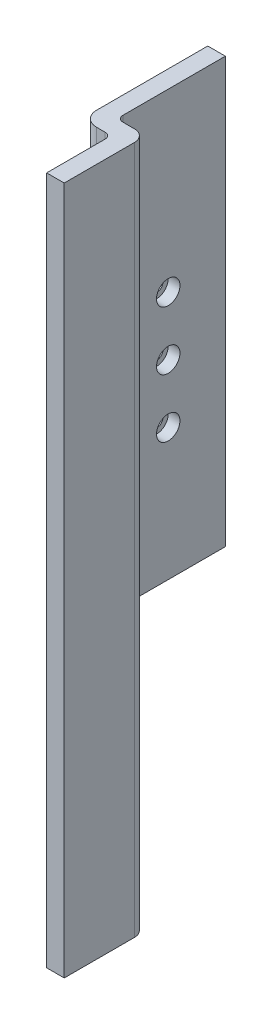
ISO-10303-21;
HEADER;
FILE_DESCRIPTION(('STEP AP214'),'2;1');
FILE_NAME('part.step','',(''),(''),'','','');
FILE_SCHEMA(('AUTOMOTIVE_DESIGN { 1 0 10303 214 1 1 1 1 }'));
ENDSEC;
DATA;
#1=APPLICATION_CONTEXT('core data for automotive mechanical design processes');
#2=APPLICATION_PROTOCOL_DEFINITION('international standard','automotive_design',2000,#1);
#3=PRODUCT_CONTEXT('',#1,'mechanical');
#4=PRODUCT('Part','Part','',(#3));
#5=PRODUCT_RELATED_PRODUCT_CATEGORY('part','',(#4));
#6=PRODUCT_DEFINITION_FORMATION('','',#4);
#7=PRODUCT_DEFINITION_CONTEXT('part definition',#1,'design');
#8=PRODUCT_DEFINITION('design','',#6,#7);
#9=PRODUCT_DEFINITION_SHAPE('','',#8);
#10=(LENGTH_UNIT() NAMED_UNIT(*) SI_UNIT(.MILLI.,.METRE.));
#11=(NAMED_UNIT(*) PLANE_ANGLE_UNIT() SI_UNIT($,.RADIAN.));
#12=(NAMED_UNIT(*) SI_UNIT($,.STERADIAN.) SOLID_ANGLE_UNIT());
#13=UNCERTAINTY_MEASURE_WITH_UNIT(LENGTH_MEASURE(1.E-05),#10,'distance_accuracy_value','');
#14=(GEOMETRIC_REPRESENTATION_CONTEXT(3) GLOBAL_UNCERTAINTY_ASSIGNED_CONTEXT((#13)) GLOBAL_UNIT_ASSIGNED_CONTEXT((#10,
#11,#12)) REPRESENTATION_CONTEXT('',''));
#15=CARTESIAN_POINT('',(0.,0.,0.));
#16=DIRECTION('',(0.,0.,1.));
#17=DIRECTION('',(1.,0.,0.));
#18=AXIS2_PLACEMENT_3D('',#15,#16,#17);
#19=CARTESIAN_POINT('',(8.,235.,-10.5));
#20=DIRECTION('',(0.,1.,0.));
#21=DIRECTION('',(1.,0.,0.));
#22=AXIS2_PLACEMENT_3D('',#19,#20,#21);
#23=PLANE('',#22);
#24=CARTESIAN_POINT('',(5.,235.,-5.));
#25=DIRECTION('',(0.,-1.,0.));
#26=DIRECTION('',(-0.707106781186548,0.,0.707106781186547));
#27=AXIS2_PLACEMENT_3D('',#24,#25,#26);
#28=CIRCLE('',#27,5.);
#29=CARTESIAN_POINT('',(5.,235.,0.));
#30=VERTEX_POINT('',#29);
#31=CARTESIAN_POINT('',(0.,235.,-5.));
#32=VERTEX_POINT('',#31);
#33=EDGE_CURVE('E201',#30,#32,#28,.T.);
#34=ORIENTED_EDGE('',*,*,#33,.F.);
#35=DIRECTION('',(1.,0.,0.));
#36=VECTOR('',#35,1.);
#37=CARTESIAN_POINT('',(0.,235.,0.));
#38=LINE('',#37,#36);
#39=CARTESIAN_POINT('',(8.,235.,0.));
#40=VERTEX_POINT('',#39);
#41=EDGE_CURVE('E238',#30,#40,#38,.T.);
#42=ORIENTED_EDGE('',*,*,#41,.T.);
#43=CARTESIAN_POINT('',(8.,235.,2.));
#44=DIRECTION('',(0.,1.,0.));
#45=DIRECTION('',(0.707106781186548,0.,-0.707106781186547));
#46=AXIS2_PLACEMENT_3D('',#43,#44,#45);
#47=CIRCLE('',#46,2.);
#48=CARTESIAN_POINT('',(10.,235.,2.));
#49=VERTEX_POINT('',#48);
#50=EDGE_CURVE('E316',#49,#40,#47,.T.);
#51=ORIENTED_EDGE('',*,*,#50,.F.);
#52=DIRECTION('',(0.,0.,1.));
#53=VECTOR('',#52,1.);
#54=CARTESIAN_POINT('',(10.,235.,0.));
#55=LINE('',#54,#53);
#56=CARTESIAN_POINT('',(10.,235.,22.));
#57=VERTEX_POINT('',#56);
#58=EDGE_CURVE('E368',#49,#57,#55,.T.);
#59=ORIENTED_EDGE('',*,*,#58,.T.);
#60=DIRECTION('',(1.,0.,0.));
#61=VECTOR('',#60,1.);
#62=CARTESIAN_POINT('',(10.,235.,22.));
#63=LINE('',#62,#61);
#64=CARTESIAN_POINT('',(16.,235.,22.));
#65=VERTEX_POINT('',#64);
#66=EDGE_CURVE('E25',#57,#65,#63,.T.);
#67=ORIENTED_EDGE('',*,*,#66,.T.);
#68=DIRECTION('',(0.,0.,-1.));
#69=VECTOR('',#68,1.);
#70=CARTESIAN_POINT('',(16.,235.,22.));
#71=LINE('',#70,#69);
#72=CARTESIAN_POINT('',(16.,235.,-2.));
#73=VERTEX_POINT('',#72);
#74=EDGE_CURVE('E389',#65,#73,#71,.T.);
#75=ORIENTED_EDGE('',*,*,#74,.T.);
#76=CARTESIAN_POINT('',(12.,235.,-2.));
#77=DIRECTION('',(0.,-1.,0.));
#78=DIRECTION('',(0.707106781186548,0.,-0.707106781186547));
#79=AXIS2_PLACEMENT_3D('',#76,#77,#78);
#80=CIRCLE('',#79,4.);
#81=CARTESIAN_POINT('',(12.,235.,-6.));
#82=VERTEX_POINT('',#81);
#83=EDGE_CURVE('E329',#82,#73,#80,.T.);
#84=ORIENTED_EDGE('',*,*,#83,.F.);
#85=DIRECTION('',(-1.,0.,0.));
#86=VECTOR('',#85,1.);
#87=CARTESIAN_POINT('',(16.,235.,-6.));
#88=LINE('',#87,#86);
#89=CARTESIAN_POINT('',(8.,235.,-6.));
#90=VERTEX_POINT('',#89);
#91=EDGE_CURVE('E275',#82,#90,#88,.T.);
#92=ORIENTED_EDGE('',*,*,#91,.T.);
#93=CARTESIAN_POINT('',(8.,235.,-8.));
#94=DIRECTION('',(0.,1.,0.));
#95=DIRECTION('',(-0.707106781186548,0.,0.707106781186547));
#96=AXIS2_PLACEMENT_3D('',#93,#94,#95);
#97=CIRCLE('',#96,2.);
#98=CARTESIAN_POINT('',(6.,235.,-8.));
#99=VERTEX_POINT('',#98);
#100=EDGE_CURVE('E339',#99,#90,#97,.T.);
#101=ORIENTED_EDGE('',*,*,#100,.F.);
#102=DIRECTION('',(0.,0.,-1.));
#103=VECTOR('',#102,1.);
#104=CARTESIAN_POINT('',(6.,235.,-6.));
#105=LINE('',#104,#103);
#106=CARTESIAN_POINT('',(6.,235.,-43.));
#107=VERTEX_POINT('',#106);
#108=EDGE_CURVE('E334',#99,#107,#105,.T.);
#109=ORIENTED_EDGE('',*,*,#108,.T.);
#110=DIRECTION('',(-1.,0.,0.));
#111=VECTOR('',#110,1.);
#112=CARTESIAN_POINT('',(6.,235.,-43.));
#113=LINE('',#112,#111);
#114=CARTESIAN_POINT('',(0.,235.,-43.));
#115=VERTEX_POINT('',#114);
#116=EDGE_CURVE('E203',#107,#115,#113,.T.);
#117=ORIENTED_EDGE('',*,*,#116,.T.);
#118=DIRECTION('',(0.,0.,1.));
#119=VECTOR('',#118,1.);
#120=CARTESIAN_POINT('',(0.,235.,-43.));
#121=LINE('',#120,#119);
#122=EDGE_CURVE('E11',#115,#32,#121,.T.);
#123=ORIENTED_EDGE('',*,*,#122,.T.);
#124=EDGE_LOOP('',(#34,#42,#51,#59,#67,#75,#84,#92,#101,#109,#117,#123));
#125=FACE_BOUND('',#124,.T.);
#126=ADVANCED_FACE('F17',(#125),#23,.T.);
#127=CARTESIAN_POINT('',(0.,0.,-43.));
#128=DIRECTION('',(-1.,0.,0.));
#129=DIRECTION('',(0.,0.,1.));
#130=AXIS2_PLACEMENT_3D('',#127,#128,#129);
#131=PLANE('',#130);
#132=CARTESIAN_POINT('',(0.,175.,-23.5));
#133=DIRECTION('',(1.,0.,0.));
#134=DIRECTION('',(0.,1.,0.));
#135=AXIS2_PLACEMENT_3D('',#132,#133,#134);
#136=CIRCLE('',#135,2.25);
#137=CARTESIAN_POINT('',(0.,172.75,-23.5));
#138=VERTEX_POINT('',#137);
#139=EDGE_CURVE('E221',#138,#138,#136,.T.);
#140=ORIENTED_EDGE('',*,*,#139,.T.);
#141=EDGE_LOOP('',(#140));
#142=FACE_BOUND('',#141,.T.);
#143=CARTESIAN_POINT('',(0.,155.,-23.5));
#144=DIRECTION('',(1.,0.,0.));
#145=DIRECTION('',(0.,1.,0.));
#146=AXIS2_PLACEMENT_3D('',#143,#144,#145);
#147=CIRCLE('',#146,2.25);
#148=CARTESIAN_POINT('',(0.,152.75,-23.5));
#149=VERTEX_POINT('',#148);
#150=EDGE_CURVE('E271',#149,#149,#147,.T.);
#151=ORIENTED_EDGE('',*,*,#150,.T.);
#152=EDGE_LOOP('',(#151));
#153=FACE_BOUND('',#152,.T.);
#154=CARTESIAN_POINT('',(0.,135.,-23.5));
#155=DIRECTION('',(1.,0.,0.));
#156=DIRECTION('',(0.,1.,0.));
#157=AXIS2_PLACEMENT_3D('',#154,#155,#156);
#158=CIRCLE('',#157,2.25);
#159=CARTESIAN_POINT('',(0.,132.75,-23.5));
#160=VERTEX_POINT('',#159);
#161=EDGE_CURVE('E264',#160,#160,#158,.T.);
#162=ORIENTED_EDGE('',*,*,#161,.T.);
#163=EDGE_LOOP('',(#162));
#164=FACE_BOUND('',#163,.T.);
#165=DIRECTION('',(0.,-1.,0.));
#166=VECTOR('',#165,1.);
#167=CARTESIAN_POINT('',(0.,0.,-5.));
#168=LINE('',#167,#166);
#169=CARTESIAN_POINT('',(0.,0.,-5.));
#170=VERTEX_POINT('',#169);
#171=EDGE_CURVE('E206',#32,#170,#168,.T.);
#172=ORIENTED_EDGE('',*,*,#171,.F.);
#173=ORIENTED_EDGE('',*,*,#122,.F.);
#174=DIRECTION('',(0.,1.,0.));
#175=VECTOR('',#174,1.);
#176=CARTESIAN_POINT('',(0.,0.,-43.));
#177=LINE('',#176,#175);
#178=CARTESIAN_POINT('',(0.,90.,-43.));
#179=VERTEX_POINT('',#178);
#180=EDGE_CURVE('E327',#179,#115,#177,.T.);
#181=ORIENTED_EDGE('',*,*,#180,.F.);
#182=DIRECTION('',(0.,0.,1.));
#183=VECTOR('',#182,1.);
#184=CARTESIAN_POINT('',(0.,90.,-25.5));
#185=LINE('',#184,#183);
#186=CARTESIAN_POINT('',(0.,90.,-14.));
#187=VERTEX_POINT('',#186);
#188=EDGE_CURVE('E328',#179,#187,#185,.T.);
#189=ORIENTED_EDGE('',*,*,#188,.T.);
#190=CARTESIAN_POINT('',(0.,84.,-14.));
#191=DIRECTION('',(-1.,0.,0.));
#192=DIRECTION('',(0.,0.707106781186546,0.707106781186549));
#193=AXIS2_PLACEMENT_3D('',#190,#191,#192);
#194=CIRCLE('',#193,6.);
#195=CARTESIAN_POINT('',(0.,84.,-8.));
#196=VERTEX_POINT('',#195);
#197=EDGE_CURVE('E375',#196,#187,#194,.T.);
#198=ORIENTED_EDGE('',*,*,#197,.F.);
#199=DIRECTION('',(0.,-1.,0.));
#200=VECTOR('',#199,1.);
#201=CARTESIAN_POINT('',(0.,0.,-8.));
#202=LINE('',#201,#200);
#203=CARTESIAN_POINT('',(0.,0.,-8.));
#204=VERTEX_POINT('',#203);
#205=EDGE_CURVE('E382',#196,#204,#202,.T.);
#206=ORIENTED_EDGE('',*,*,#205,.T.);
#207=DIRECTION('',(0.,0.,1.));
#208=VECTOR('',#207,1.);
#209=CARTESIAN_POINT('',(0.,0.,-43.));
#210=LINE('',#209,#208);
#211=EDGE_CURVE('E209',#204,#170,#210,.T.);
#212=ORIENTED_EDGE('',*,*,#211,.T.);
#213=EDGE_LOOP('',(#172,#173,#181,#189,#198,#206,#212));
#214=FACE_BOUND('',#213,.T.);
#215=ADVANCED_FACE('F207',(#142,#153,#164,#214),#131,.T.);
#216=CARTESIAN_POINT('',(10.,0.,22.));
#217=DIRECTION('',(0.,0.,1.));
#218=DIRECTION('',(1.,0.,0.));
#219=AXIS2_PLACEMENT_3D('',#216,#217,#218);
#220=PLANE('',#219);
#221=DIRECTION('',(1.,0.,0.));
#222=VECTOR('',#221,1.);
#223=CARTESIAN_POINT('',(10.,0.,22.));
#224=LINE('',#223,#222);
#225=CARTESIAN_POINT('',(10.,0.,22.));
#226=VERTEX_POINT('',#225);
#227=CARTESIAN_POINT('',(16.,0.,22.));
#228=VERTEX_POINT('',#227);
#229=EDGE_CURVE('E312',#226,#228,#224,.T.);
#230=ORIENTED_EDGE('',*,*,#229,.T.);
#231=DIRECTION('',(0.,1.,0.));
#232=VECTOR('',#231,1.);
#233=CARTESIAN_POINT('',(16.,0.,22.));
#234=LINE('',#233,#232);
#235=EDGE_CURVE('E392',#228,#65,#234,.T.);
#236=ORIENTED_EDGE('',*,*,#235,.T.);
#237=ORIENTED_EDGE('',*,*,#66,.F.);
#238=DIRECTION('',(0.,1.,0.));
#239=VECTOR('',#238,1.);
#240=CARTESIAN_POINT('',(10.,0.,22.));
#241=LINE('',#240,#239);
#242=EDGE_CURVE('E319',#226,#57,#241,.T.);
#243=ORIENTED_EDGE('',*,*,#242,.F.);
#244=EDGE_LOOP('',(#230,#236,#237,#243));
#245=FACE_BOUND('',#244,.T.);
#246=ADVANCED_FACE('F646',(#245),#220,.T.);
#247=CARTESIAN_POINT('',(16.,0.,22.));
#248=DIRECTION('',(1.,0.,0.));
#249=DIRECTION('',(0.,0.,1.));
#250=AXIS2_PLACEMENT_3D('',#247,#248,#249);
#251=PLANE('',#250);
#252=DIRECTION('',(0.,-1.,0.));
#253=VECTOR('',#252,1.);
#254=CARTESIAN_POINT('',(16.,0.,-2.));
#255=LINE('',#254,#253);
#256=CARTESIAN_POINT('',(16.,0.,-2.));
#257=VERTEX_POINT('',#256);
#258=EDGE_CURVE('E333',#73,#257,#255,.T.);
#259=ORIENTED_EDGE('',*,*,#258,.F.);
#260=ORIENTED_EDGE('',*,*,#74,.F.);
#261=ORIENTED_EDGE('',*,*,#235,.F.);
#262=DIRECTION('',(0.,0.,-1.));
#263=VECTOR('',#262,1.);
#264=CARTESIAN_POINT('',(16.,0.,22.));
#265=LINE('',#264,#263);
#266=EDGE_CURVE('E294',#228,#257,#265,.T.);
#267=ORIENTED_EDGE('',*,*,#266,.T.);
#268=EDGE_LOOP('',(#259,#260,#261,#267));
#269=FACE_BOUND('',#268,.T.);
#270=ADVANCED_FACE('F652',(#269),#251,.T.);
#271=CARTESIAN_POINT('',(6.,0.,-43.));
#272=DIRECTION('',(0.,0.,-1.));
#273=DIRECTION('',(0.,-1.,0.));
#274=AXIS2_PLACEMENT_3D('',#271,#272,#273);
#275=PLANE('',#274);
#276=DIRECTION('',(-1.,0.,0.));
#277=VECTOR('',#276,1.);
#278=CARTESIAN_POINT('',(6.,90.,-43.));
#279=LINE('',#278,#277);
#280=CARTESIAN_POINT('',(6.,90.,-43.));
#281=VERTEX_POINT('',#280);
#282=EDGE_CURVE('E323',#281,#179,#279,.T.);
#283=ORIENTED_EDGE('',*,*,#282,.T.);
#284=ORIENTED_EDGE('',*,*,#180,.T.);
#285=ORIENTED_EDGE('',*,*,#116,.F.);
#286=DIRECTION('',(0.,1.,0.));
#287=VECTOR('',#286,1.);
#288=CARTESIAN_POINT('',(6.,0.,-43.));
#289=LINE('',#288,#287);
#290=EDGE_CURVE('E354',#281,#107,#289,.T.);
#291=ORIENTED_EDGE('',*,*,#290,.F.);
#292=EDGE_LOOP('',(#283,#284,#285,#291));
#293=FACE_BOUND('',#292,.T.);
#294=ADVANCED_FACE('F659',(#293),#275,.T.);
#295=CARTESIAN_POINT('',(6.,90.,-8.));
#296=DIRECTION('',(0.,1.,0.));
#297=DIRECTION('',(1.,0.,0.));
#298=AXIS2_PLACEMENT_3D('',#295,#296,#297);
#299=PLANE('',#298);
#300=DIRECTION('',(1.,0.,0.));
#301=VECTOR('',#300,1.);
#302=CARTESIAN_POINT('',(6.,90.,-14.));
#303=LINE('',#302,#301);
#304=CARTESIAN_POINT('',(6.,90.,-14.));
#305=VERTEX_POINT('',#304);
#306=EDGE_CURVE('E379',#187,#305,#303,.T.);
#307=ORIENTED_EDGE('',*,*,#306,.F.);
#308=ORIENTED_EDGE('',*,*,#188,.F.);
#309=ORIENTED_EDGE('',*,*,#282,.F.);
#310=DIRECTION('',(0.,0.,-1.));
#311=VECTOR('',#310,1.);
#312=CARTESIAN_POINT('',(6.,90.,-7.));
#313=LINE('',#312,#311);
#314=EDGE_CURVE('E350',#305,#281,#313,.T.);
#315=ORIENTED_EDGE('',*,*,#314,.F.);
#316=EDGE_LOOP('',(#307,#308,#309,#315));
#317=FACE_BOUND('',#316,.T.);
#318=ADVANCED_FACE('F663',(#317),#299,.F.);
#319=CARTESIAN_POINT('',(6.,0.,-8.));
#320=DIRECTION('',(0.,0.,1.));
#321=DIRECTION('',(1.,0.,0.));
#322=AXIS2_PLACEMENT_3D('',#319,#320,#321);
#323=PLANE('',#322);
#324=DIRECTION('',(-1.,0.,0.));
#325=VECTOR('',#324,1.);
#326=CARTESIAN_POINT('',(6.,84.,-8.));
#327=LINE('',#326,#325);
#328=CARTESIAN_POINT('',(6.,84.,-8.));
#329=VERTEX_POINT('',#328);
#330=EDGE_CURVE('E371',#329,#196,#327,.T.);
#331=ORIENTED_EDGE('',*,*,#330,.F.);
#332=DIRECTION('',(0.,1.,0.));
#333=VECTOR('',#332,1.);
#334=CARTESIAN_POINT('',(6.,0.,-8.));
#335=LINE('',#334,#333);
#336=CARTESIAN_POINT('',(6.,0.,-8.));
#337=VERTEX_POINT('',#336);
#338=EDGE_CURVE('E251',#337,#329,#335,.T.);
#339=ORIENTED_EDGE('',*,*,#338,.F.);
#340=DIRECTION('',(1.,0.,0.));
#341=VECTOR('',#340,1.);
#342=CARTESIAN_POINT('',(7.,0.,-8.));
#343=LINE('',#342,#341);
#344=EDGE_CURVE('E298',#204,#337,#343,.T.);
#345=ORIENTED_EDGE('',*,*,#344,.F.);
#346=ORIENTED_EDGE('',*,*,#205,.F.);
#347=EDGE_LOOP('',(#331,#339,#345,#346));
#348=FACE_BOUND('',#347,.T.);
#349=ADVANCED_FACE('F667',(#348),#323,.F.);
#350=CARTESIAN_POINT('',(6.,84.,-14.));
#351=DIRECTION('',(-1.,0.,0.));
#352=DIRECTION('',(0.,0.707106781186546,0.707106781186549));
#353=AXIS2_PLACEMENT_3D('',#350,#351,#352);
#354=CYLINDRICAL_SURFACE('',#353,6.);
#355=CARTESIAN_POINT('',(6.,84.,-14.));
#356=DIRECTION('',(1.,0.,0.));
#357=DIRECTION('',(0.,0.707106781186546,0.707106781186549));
#358=AXIS2_PLACEMENT_3D('',#355,#356,#357);
#359=CIRCLE('',#358,6.);
#360=EDGE_CURVE('E346',#305,#329,#359,.T.);
#361=ORIENTED_EDGE('',*,*,#360,.T.);
#362=ORIENTED_EDGE('',*,*,#330,.T.);
#363=ORIENTED_EDGE('',*,*,#197,.T.);
#364=ORIENTED_EDGE('',*,*,#306,.T.);
#365=EDGE_LOOP('',(#361,#362,#363,#364));
#366=FACE_BOUND('',#365,.T.);
#367=ADVANCED_FACE('F669',(#366),#354,.F.);
#368=CARTESIAN_POINT('',(10.,0.,0.));
#369=DIRECTION('',(-1.,0.,0.));
#370=DIRECTION('',(0.,0.,1.));
#371=AXIS2_PLACEMENT_3D('',#368,#369,#370);
#372=PLANE('',#371);
#373=DIRECTION('',(0.,1.,0.));
#374=VECTOR('',#373,1.);
#375=CARTESIAN_POINT('',(10.,0.,2.));
#376=LINE('',#375,#374);
#377=CARTESIAN_POINT('',(10.,0.,2.));
#378=VERTEX_POINT('',#377);
#379=EDGE_CURVE('E278',#378,#49,#376,.T.);
#380=ORIENTED_EDGE('',*,*,#379,.F.);
#381=DIRECTION('',(0.,0.,1.));
#382=VECTOR('',#381,1.);
#383=CARTESIAN_POINT('',(10.,0.,0.));
#384=LINE('',#383,#382);
#385=EDGE_CURVE('E252',#378,#226,#384,.T.);
#386=ORIENTED_EDGE('',*,*,#385,.T.);
#387=ORIENTED_EDGE('',*,*,#242,.T.);
#388=ORIENTED_EDGE('',*,*,#58,.F.);
#389=EDGE_LOOP('',(#380,#386,#387,#388));
#390=FACE_BOUND('',#389,.T.);
#391=ADVANCED_FACE('F672',(#390),#372,.T.);
#392=CARTESIAN_POINT('',(8.,0.,2.));
#393=DIRECTION('',(0.,1.,0.));
#394=DIRECTION('',(0.707106781186548,0.,-0.707106781186547));
#395=AXIS2_PLACEMENT_3D('',#392,#393,#394);
#396=CYLINDRICAL_SURFACE('',#395,2.);
#397=CARTESIAN_POINT('',(8.,0.,2.));
#398=DIRECTION('',(0.,-1.,0.));
#399=DIRECTION('',(0.707106781186548,0.,-0.707106781186547));
#400=AXIS2_PLACEMENT_3D('',#397,#398,#399);
#401=CIRCLE('',#400,2.);
#402=CARTESIAN_POINT('',(8.,0.,0.));
#403=VERTEX_POINT('',#402);
#404=EDGE_CURVE('E247',#403,#378,#401,.T.);
#405=ORIENTED_EDGE('',*,*,#404,.T.);
#406=ORIENTED_EDGE('',*,*,#379,.T.);
#407=ORIENTED_EDGE('',*,*,#50,.T.);
#408=DIRECTION('',(0.,-1.,0.));
#409=VECTOR('',#408,1.);
#410=CARTESIAN_POINT('',(8.,0.,0.));
#411=LINE('',#410,#409);
#412=EDGE_CURVE('E241',#40,#403,#411,.T.);
#413=ORIENTED_EDGE('',*,*,#412,.T.);
#414=EDGE_LOOP('',(#405,#406,#407,#413));
#415=FACE_BOUND('',#414,.T.);
#416=ADVANCED_FACE('F675',(#415),#396,.F.);
#417=CARTESIAN_POINT('',(16.,0.,-6.));
#418=DIRECTION('',(0.,0.,-1.));
#419=DIRECTION('',(0.,-1.,0.));
#420=AXIS2_PLACEMENT_3D('',#417,#418,#419);
#421=PLANE('',#420);
#422=DIRECTION('',(0.,-1.,0.));
#423=VECTOR('',#422,1.);
#424=CARTESIAN_POINT('',(8.,0.,-6.));
#425=LINE('',#424,#423);
#426=CARTESIAN_POINT('',(8.,0.,-6.));
#427=VERTEX_POINT('',#426);
#428=EDGE_CURVE('E343',#90,#427,#425,.T.);
#429=ORIENTED_EDGE('',*,*,#428,.F.);
#430=ORIENTED_EDGE('',*,*,#91,.F.);
#431=DIRECTION('',(0.,1.,0.));
#432=VECTOR('',#431,1.);
#433=CARTESIAN_POINT('',(12.,0.,-6.));
#434=LINE('',#433,#432);
#435=CARTESIAN_POINT('',(12.,0.,-6.));
#436=VERTEX_POINT('',#435);
#437=EDGE_CURVE('E279',#436,#82,#434,.T.);
#438=ORIENTED_EDGE('',*,*,#437,.F.);
#439=DIRECTION('',(-1.,0.,0.));
#440=VECTOR('',#439,1.);
#441=CARTESIAN_POINT('',(16.,0.,-6.));
#442=LINE('',#441,#440);
#443=EDGE_CURVE('E295',#436,#427,#442,.T.);
#444=ORIENTED_EDGE('',*,*,#443,.T.);
#445=EDGE_LOOP('',(#429,#430,#438,#444));
#446=FACE_BOUND('',#445,.T.);
#447=ADVANCED_FACE('F680',(#446),#421,.T.);
#448=CARTESIAN_POINT('',(12.,0.,-2.));
#449=DIRECTION('',(0.,1.,0.));
#450=DIRECTION('',(0.707106781186548,0.,-0.707106781186547));
#451=AXIS2_PLACEMENT_3D('',#448,#449,#450);
#452=CYLINDRICAL_SURFACE('',#451,4.);
#453=ORIENTED_EDGE('',*,*,#83,.T.);
#454=ORIENTED_EDGE('',*,*,#258,.T.);
#455=CARTESIAN_POINT('',(12.,0.,-2.));
#456=DIRECTION('',(0.,1.,0.));
#457=DIRECTION('',(0.707106781186548,0.,-0.707106781186547));
#458=AXIS2_PLACEMENT_3D('',#455,#456,#457);
#459=CIRCLE('',#458,4.);
#460=EDGE_CURVE('E290',#257,#436,#459,.T.);
#461=ORIENTED_EDGE('',*,*,#460,.T.);
#462=ORIENTED_EDGE('',*,*,#437,.T.);
#463=EDGE_LOOP('',(#453,#454,#461,#462));
#464=FACE_BOUND('',#463,.T.);
#465=ADVANCED_FACE('F685',(#464),#452,.T.);
#466=CARTESIAN_POINT('',(6.,0.,-6.));
#467=DIRECTION('',(1.,0.,0.));
#468=DIRECTION('',(0.,0.,-1.));
#469=AXIS2_PLACEMENT_3D('',#466,#467,#468);
#470=PLANE('',#469);
#471=CARTESIAN_POINT('',(6.,175.,-23.5));
#472=DIRECTION('',(-1.,0.,0.));
#473=DIRECTION('',(0.,1.,0.));
#474=AXIS2_PLACEMENT_3D('',#471,#472,#473);
#475=CIRCLE('',#474,4.);
#476=CARTESIAN_POINT('',(6.,171.,-23.5));
#477=VERTEX_POINT('',#476);
#478=EDGE_CURVE('E242',#477,#477,#475,.T.);
#479=ORIENTED_EDGE('',*,*,#478,.T.);
#480=EDGE_LOOP('',(#479));
#481=FACE_BOUND('',#480,.T.);
#482=CARTESIAN_POINT('',(6.,155.,-23.5));
#483=DIRECTION('',(-1.,0.,0.));
#484=DIRECTION('',(0.,1.,0.));
#485=AXIS2_PLACEMENT_3D('',#482,#483,#484);
#486=CIRCLE('',#485,4.);
#487=CARTESIAN_POINT('',(6.,151.,-23.5));
#488=VERTEX_POINT('',#487);
#489=EDGE_CURVE('E231',#488,#488,#486,.T.);
#490=ORIENTED_EDGE('',*,*,#489,.T.);
#491=EDGE_LOOP('',(#490));
#492=FACE_BOUND('',#491,.T.);
#493=CARTESIAN_POINT('',(6.,135.,-23.5));
#494=DIRECTION('',(-1.,0.,0.));
#495=DIRECTION('',(0.,1.,0.));
#496=AXIS2_PLACEMENT_3D('',#493,#494,#495);
#497=CIRCLE('',#496,4.);
#498=CARTESIAN_POINT('',(6.,131.,-23.5));
#499=VERTEX_POINT('',#498);
#500=EDGE_CURVE('E609',#499,#499,#497,.T.);
#501=ORIENTED_EDGE('',*,*,#500,.T.);
#502=EDGE_LOOP('',(#501));
#503=FACE_BOUND('',#502,.T.);
#504=DIRECTION('',(0.,1.,0.));
#505=VECTOR('',#504,1.);
#506=CARTESIAN_POINT('',(6.,0.,-8.));
#507=LINE('',#506,#505);
#508=EDGE_CURVE('E335',#329,#99,#507,.T.);
#509=ORIENTED_EDGE('',*,*,#508,.F.);
#510=ORIENTED_EDGE('',*,*,#360,.F.);
#511=ORIENTED_EDGE('',*,*,#314,.T.);
#512=ORIENTED_EDGE('',*,*,#290,.T.);
#513=ORIENTED_EDGE('',*,*,#108,.F.);
#514=EDGE_LOOP('',(#509,#510,#511,#512,#513));
#515=FACE_BOUND('',#514,.T.);
#516=ADVANCED_FACE('F618',(#481,#492,#503,#515),#470,.T.);
#517=CARTESIAN_POINT('',(8.,0.,-8.));
#518=DIRECTION('',(0.,1.,0.));
#519=DIRECTION('',(-0.707106781186548,0.,0.707106781186547));
#520=AXIS2_PLACEMENT_3D('',#517,#518,#519);
#521=CYLINDRICAL_SURFACE('',#520,2.);
#522=CARTESIAN_POINT('',(8.,0.,-8.));
#523=DIRECTION('',(0.,-1.,0.));
#524=DIRECTION('',(-0.707106781186548,0.,0.707106781186547));
#525=AXIS2_PLACEMENT_3D('',#522,#523,#524);
#526=CIRCLE('',#525,2.);
#527=EDGE_CURVE('E302',#427,#337,#526,.T.);
#528=ORIENTED_EDGE('',*,*,#527,.T.);
#529=ORIENTED_EDGE('',*,*,#338,.T.);
#530=ORIENTED_EDGE('',*,*,#508,.T.);
#531=ORIENTED_EDGE('',*,*,#100,.T.);
#532=ORIENTED_EDGE('',*,*,#428,.T.);
#533=EDGE_LOOP('',(#528,#529,#530,#531,#532));
#534=FACE_BOUND('',#533,.T.);
#535=ADVANCED_FACE('F684',(#534),#521,.F.);
#536=CARTESIAN_POINT('',(8.,0.,-10.5));
#537=DIRECTION('',(0.,1.,0.));
#538=DIRECTION('',(1.,0.,0.));
#539=AXIS2_PLACEMENT_3D('',#536,#537,#538);
#540=PLANE('',#539);
#541=CARTESIAN_POINT('',(5.,0.,-5.));
#542=DIRECTION('',(0.,1.,0.));
#543=DIRECTION('',(-0.707106781186548,0.,0.707106781186547));
#544=AXIS2_PLACEMENT_3D('',#541,#542,#543);
#545=CIRCLE('',#544,5.);
#546=CARTESIAN_POINT('',(5.,0.,0.));
#547=VERTEX_POINT('',#546);
#548=EDGE_CURVE('E214',#170,#547,#545,.T.);
#549=ORIENTED_EDGE('',*,*,#548,.F.);
#550=ORIENTED_EDGE('',*,*,#211,.F.);
#551=ORIENTED_EDGE('',*,*,#344,.T.);
#552=ORIENTED_EDGE('',*,*,#527,.F.);
#553=ORIENTED_EDGE('',*,*,#443,.F.);
#554=ORIENTED_EDGE('',*,*,#460,.F.);
#555=ORIENTED_EDGE('',*,*,#266,.F.);
#556=ORIENTED_EDGE('',*,*,#229,.F.);
#557=ORIENTED_EDGE('',*,*,#385,.F.);
#558=ORIENTED_EDGE('',*,*,#404,.F.);
#559=DIRECTION('',(1.,0.,0.));
#560=VECTOR('',#559,1.);
#561=CARTESIAN_POINT('',(0.,0.,0.));
#562=LINE('',#561,#560);
#563=EDGE_CURVE('E286',#547,#403,#562,.T.);
#564=ORIENTED_EDGE('',*,*,#563,.F.);
#565=EDGE_LOOP('',(#549,#550,#551,#552,#553,#554,#555,#556,#557,#558,#564));
#566=FACE_BOUND('',#565,.T.);
#567=ADVANCED_FACE('F689',(#566),#540,.F.);
#568=CARTESIAN_POINT('',(0.,0.,0.));
#569=DIRECTION('',(0.,0.,1.));
#570=DIRECTION('',(1.,0.,0.));
#571=AXIS2_PLACEMENT_3D('',#568,#569,#570);
#572=PLANE('',#571);
#573=DIRECTION('',(0.,1.,0.));
#574=VECTOR('',#573,1.);
#575=CARTESIAN_POINT('',(5.,0.,0.));
#576=LINE('',#575,#574);
#577=EDGE_CURVE('E219',#547,#30,#576,.T.);
#578=ORIENTED_EDGE('',*,*,#577,.F.);
#579=ORIENTED_EDGE('',*,*,#563,.T.);
#580=ORIENTED_EDGE('',*,*,#412,.F.);
#581=ORIENTED_EDGE('',*,*,#41,.F.);
#582=EDGE_LOOP('',(#578,#579,#580,#581));
#583=FACE_BOUND('',#582,.T.);
#584=ADVANCED_FACE('F719',(#583),#572,.T.);
#585=CARTESIAN_POINT('',(5.,0.,-5.));
#586=DIRECTION('',(0.,1.,0.));
#587=DIRECTION('',(-0.707106781186548,0.,0.707106781186547));
#588=AXIS2_PLACEMENT_3D('',#585,#586,#587);
#589=CYLINDRICAL_SURFACE('',#588,5.);
#590=ORIENTED_EDGE('',*,*,#33,.T.);
#591=ORIENTED_EDGE('',*,*,#171,.T.);
#592=ORIENTED_EDGE('',*,*,#548,.T.);
#593=ORIENTED_EDGE('',*,*,#577,.T.);
#594=EDGE_LOOP('',(#590,#591,#592,#593));
#595=FACE_BOUND('',#594,.T.);
#596=ADVANCED_FACE('F217',(#595),#589,.T.);
#597=CARTESIAN_POINT('',(6.,175.,-23.5));
#598=DIRECTION('',(-1.,0.,0.));
#599=DIRECTION('',(0.,1.,0.));
#600=AXIS2_PLACEMENT_3D('',#597,#598,#599);
#601=CYLINDRICAL_SURFACE('',#600,2.25);
#602=CARTESIAN_POINT('',(2.,175.,-23.5));
#603=DIRECTION('',(1.,0.,0.));
#604=DIRECTION('',(0.,1.,0.));
#605=AXIS2_PLACEMENT_3D('',#602,#603,#604);
#606=CIRCLE('',#605,2.25);
#607=CARTESIAN_POINT('',(2.,172.75,-23.5));
#608=VERTEX_POINT('',#607);
#609=EDGE_CURVE('E257',#608,#608,#606,.T.);
#610=ORIENTED_EDGE('',*,*,#609,.T.);
#611=DIRECTION('',(-1.,0.,0.));
#612=VECTOR('',#611,1.);
#613=CARTESIAN_POINT('',(6.,172.75,-23.5));
#614=LINE('',#613,#612);
#615=EDGE_CURVE('E227',#608,#138,#614,.T.);
#616=ORIENTED_EDGE('',*,*,#615,.T.);
#617=ORIENTED_EDGE('',*,*,#139,.F.);
#618=ORIENTED_EDGE('',*,*,#615,.F.);
#619=EDGE_LOOP('',(#610,#616,#617,#618));
#620=FACE_BOUND('',#619,.T.);
#621=ADVANCED_FACE('F695',(#620),#601,.F.);
#622=CARTESIAN_POINT('',(6.,155.,-23.5));
#623=DIRECTION('',(-1.,0.,0.));
#624=DIRECTION('',(0.,1.,0.));
#625=AXIS2_PLACEMENT_3D('',#622,#623,#624);
#626=CYLINDRICAL_SURFACE('',#625,2.25);
#627=CARTESIAN_POINT('',(2.,155.,-23.5));
#628=DIRECTION('',(1.,0.,0.));
#629=DIRECTION('',(0.,1.,0.));
#630=AXIS2_PLACEMENT_3D('',#627,#628,#629);
#631=CIRCLE('',#630,2.25);
#632=CARTESIAN_POINT('',(2.,152.75,-23.5));
#633=VERTEX_POINT('',#632);
#634=EDGE_CURVE('E236',#633,#633,#631,.T.);
#635=ORIENTED_EDGE('',*,*,#634,.T.);
#636=DIRECTION('',(-1.,0.,0.));
#637=VECTOR('',#636,1.);
#638=CARTESIAN_POINT('',(6.,152.75,-23.5));
#639=LINE('',#638,#637);
#640=EDGE_CURVE('E267',#633,#149,#639,.T.);
#641=ORIENTED_EDGE('',*,*,#640,.T.);
#642=ORIENTED_EDGE('',*,*,#150,.F.);
#643=ORIENTED_EDGE('',*,*,#640,.F.);
#644=EDGE_LOOP('',(#635,#641,#642,#643));
#645=FACE_BOUND('',#644,.T.);
#646=ADVANCED_FACE('F691',(#645),#626,.F.);
#647=CARTESIAN_POINT('',(6.,135.,-23.5));
#648=DIRECTION('',(-1.,0.,0.));
#649=DIRECTION('',(0.,1.,0.));
#650=AXIS2_PLACEMENT_3D('',#647,#648,#649);
#651=CYLINDRICAL_SURFACE('',#650,2.25);
#652=CARTESIAN_POINT('',(2.,135.,-23.5));
#653=DIRECTION('',(1.,0.,0.));
#654=DIRECTION('',(0.,1.,0.));
#655=AXIS2_PLACEMENT_3D('',#652,#653,#654);
#656=CIRCLE('',#655,2.25);
#657=CARTESIAN_POINT('',(2.,132.75,-23.5));
#658=VERTEX_POINT('',#657);
#659=EDGE_CURVE('E593',#658,#658,#656,.T.);
#660=ORIENTED_EDGE('',*,*,#659,.T.);
#661=DIRECTION('',(-1.,0.,0.));
#662=VECTOR('',#661,1.);
#663=CARTESIAN_POINT('',(6.,132.75,-23.5));
#664=LINE('',#663,#662);
#665=EDGE_CURVE('E261',#658,#160,#664,.T.);
#666=ORIENTED_EDGE('',*,*,#665,.T.);
#667=ORIENTED_EDGE('',*,*,#161,.F.);
#668=ORIENTED_EDGE('',*,*,#665,.F.);
#669=EDGE_LOOP('',(#660,#666,#667,#668));
#670=FACE_BOUND('',#669,.T.);
#671=ADVANCED_FACE('F694',(#670),#651,.F.);
#672=CARTESIAN_POINT('',(2.,175.,-23.5));
#673=DIRECTION('',(1.,0.,0.));
#674=DIRECTION('',(0.,0.,-1.));
#675=AXIS2_PLACEMENT_3D('',#672,#673,#674);
#676=PLANE('',#675);
#677=ORIENTED_EDGE('',*,*,#609,.F.);
#678=EDGE_LOOP('',(#677));
#679=FACE_BOUND('',#678,.T.);
#680=CARTESIAN_POINT('',(2.,175.,-23.5));
#681=DIRECTION('',(-1.,0.,0.));
#682=DIRECTION('',(0.,1.,0.));
#683=AXIS2_PLACEMENT_3D('',#680,#681,#682);
#684=CIRCLE('',#683,4.);
#685=CARTESIAN_POINT('',(2.,171.,-23.5));
#686=VERTEX_POINT('',#685);
#687=EDGE_CURVE('E256',#686,#686,#684,.T.);
#688=ORIENTED_EDGE('',*,*,#687,.F.);
#689=EDGE_LOOP('',(#688));
#690=FACE_BOUND('',#689,.T.);
#691=ADVANCED_FACE('F699',(#679,#690),#676,.T.);
#692=CARTESIAN_POINT('',(6.,175.,-23.5));
#693=DIRECTION('',(-1.,0.,0.));
#694=DIRECTION('',(0.,1.,0.));
#695=AXIS2_PLACEMENT_3D('',#692,#693,#694);
#696=CYLINDRICAL_SURFACE('',#695,4.);
#697=ORIENTED_EDGE('',*,*,#478,.F.);
#698=DIRECTION('',(-1.,0.,0.));
#699=VECTOR('',#698,1.);
#700=CARTESIAN_POINT('',(6.,171.,-23.5));
#701=LINE('',#700,#699);
#702=EDGE_CURVE('E246',#477,#686,#701,.T.);
#703=ORIENTED_EDGE('',*,*,#702,.T.);
#704=ORIENTED_EDGE('',*,*,#687,.T.);
#705=ORIENTED_EDGE('',*,*,#702,.F.);
#706=EDGE_LOOP('',(#697,#703,#704,#705));
#707=FACE_BOUND('',#706,.T.);
#708=ADVANCED_FACE('F706',(#707),#696,.F.);
#709=CARTESIAN_POINT('',(2.,155.,-23.5));
#710=DIRECTION('',(1.,0.,0.));
#711=DIRECTION('',(0.,0.,-1.));
#712=AXIS2_PLACEMENT_3D('',#709,#710,#711);
#713=PLANE('',#712);
#714=ORIENTED_EDGE('',*,*,#634,.F.);
#715=EDGE_LOOP('',(#714));
#716=FACE_BOUND('',#715,.T.);
#717=CARTESIAN_POINT('',(2.,155.,-23.5));
#718=DIRECTION('',(-1.,0.,0.));
#719=DIRECTION('',(0.,1.,0.));
#720=AXIS2_PLACEMENT_3D('',#717,#718,#719);
#721=CIRCLE('',#720,4.);
#722=CARTESIAN_POINT('',(2.,151.,-23.5));
#723=VERTEX_POINT('',#722);
#724=EDGE_CURVE('E233',#723,#723,#721,.T.);
#725=ORIENTED_EDGE('',*,*,#724,.F.);
#726=EDGE_LOOP('',(#725));
#727=FACE_BOUND('',#726,.T.);
#728=ADVANCED_FACE('F636',(#716,#727),#713,.T.);
#729=CARTESIAN_POINT('',(6.,155.,-23.5));
#730=DIRECTION('',(-1.,0.,0.));
#731=DIRECTION('',(0.,1.,0.));
#732=AXIS2_PLACEMENT_3D('',#729,#730,#731);
#733=CYLINDRICAL_SURFACE('',#732,4.);
#734=ORIENTED_EDGE('',*,*,#489,.F.);
#735=DIRECTION('',(-1.,0.,0.));
#736=VECTOR('',#735,1.);
#737=CARTESIAN_POINT('',(6.,151.,-23.5));
#738=LINE('',#737,#736);
#739=EDGE_CURVE('E237',#488,#723,#738,.T.);
#740=ORIENTED_EDGE('',*,*,#739,.T.);
#741=ORIENTED_EDGE('',*,*,#724,.T.);
#742=ORIENTED_EDGE('',*,*,#739,.F.);
#743=EDGE_LOOP('',(#734,#740,#741,#742));
#744=FACE_BOUND('',#743,.T.);
#745=ADVANCED_FACE('F626',(#744),#733,.F.);
#746=CARTESIAN_POINT('',(2.,135.,-23.5));
#747=DIRECTION('',(1.,0.,0.));
#748=DIRECTION('',(0.,0.,-1.));
#749=AXIS2_PLACEMENT_3D('',#746,#747,#748);
#750=PLANE('',#749);
#751=ORIENTED_EDGE('',*,*,#659,.F.);
#752=EDGE_LOOP('',(#751));
#753=FACE_BOUND('',#752,.T.);
#754=CARTESIAN_POINT('',(2.,135.,-23.5));
#755=DIRECTION('',(-1.,0.,0.));
#756=DIRECTION('',(0.,1.,0.));
#757=AXIS2_PLACEMENT_3D('',#754,#755,#756);
#758=CIRCLE('',#757,4.);
#759=CARTESIAN_POINT('',(2.,131.,-23.5));
#760=VERTEX_POINT('',#759);
#761=EDGE_CURVE('E598',#760,#760,#758,.T.);
#762=ORIENTED_EDGE('',*,*,#761,.F.);
#763=EDGE_LOOP('',(#762));
#764=FACE_BOUND('',#763,.T.);
#765=ADVANCED_FACE('F624',(#753,#764),#750,.T.);
#766=CARTESIAN_POINT('',(6.,135.,-23.5));
#767=DIRECTION('',(-1.,0.,0.));
#768=DIRECTION('',(0.,1.,0.));
#769=AXIS2_PLACEMENT_3D('',#766,#767,#768);
#770=CYLINDRICAL_SURFACE('',#769,4.);
#771=ORIENTED_EDGE('',*,*,#500,.F.);
#772=DIRECTION('',(-1.,0.,0.));
#773=VECTOR('',#772,1.);
#774=CARTESIAN_POINT('',(6.,131.,-23.5));
#775=LINE('',#774,#773);
#776=EDGE_CURVE('E603',#499,#760,#775,.T.);
#777=ORIENTED_EDGE('',*,*,#776,.T.);
#778=ORIENTED_EDGE('',*,*,#761,.T.);
#779=ORIENTED_EDGE('',*,*,#776,.F.);
#780=EDGE_LOOP('',(#771,#777,#778,#779));
#781=FACE_BOUND('',#780,.T.);
#782=ADVANCED_FACE('F621',(#781),#770,.F.);
#783=CLOSED_SHELL('',(#126,#215,#246,#270,#294,#318,#349,#367,#391,#416,#447,#465,#516,#535,
#567,#584,#596,#621,#646,#671,#691,#708,#728,#745,#765,#782));
#784=MANIFOLD_SOLID_BREP('B1',#783);
#785=ADVANCED_BREP_SHAPE_REPRESENTATION('',(#18,#784),#14);
#786=SHAPE_DEFINITION_REPRESENTATION(#9,#785);
ENDSEC;
END-ISO-10303-21;
